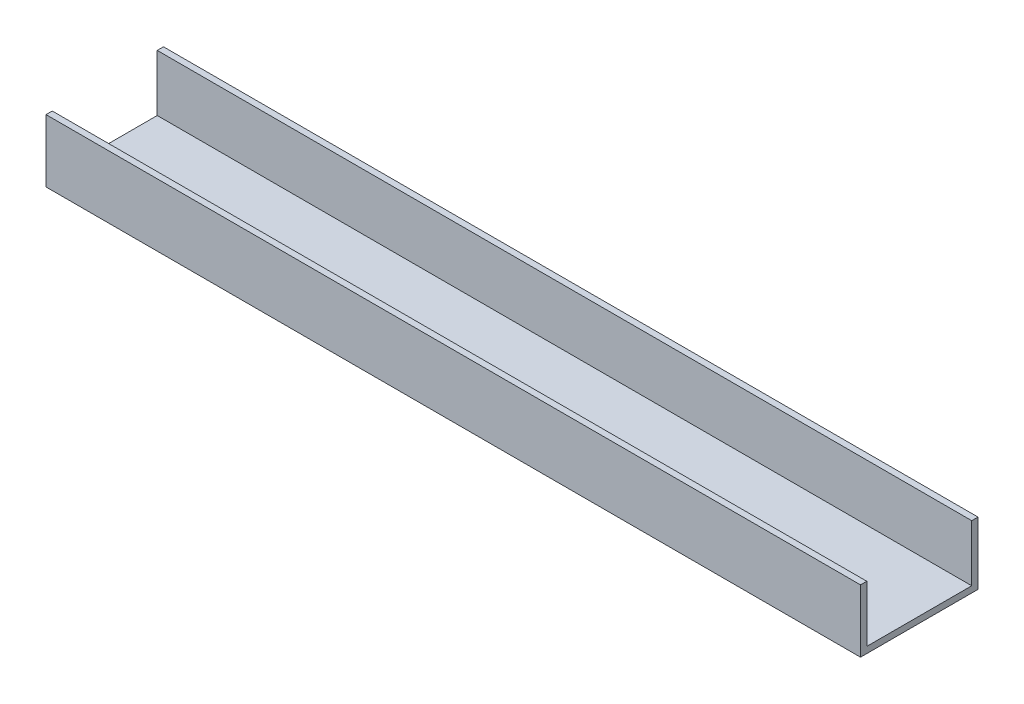
ISO-10303-21;
HEADER;
FILE_DESCRIPTION(('STEP AP214'),'2;1');
FILE_NAME('part.step','',(''),(''),'','','');
FILE_SCHEMA(('AUTOMOTIVE_DESIGN { 1 0 10303 214 1 1 1 1 }'));
ENDSEC;
DATA;
#1=APPLICATION_CONTEXT('core data for automotive mechanical design processes');
#2=APPLICATION_PROTOCOL_DEFINITION('international standard','automotive_design',2000,#1);
#3=PRODUCT_CONTEXT('',#1,'mechanical');
#4=PRODUCT('Part','Part','',(#3));
#5=PRODUCT_RELATED_PRODUCT_CATEGORY('part','',(#4));
#6=PRODUCT_DEFINITION_FORMATION('','',#4);
#7=PRODUCT_DEFINITION_CONTEXT('part definition',#1,'design');
#8=PRODUCT_DEFINITION('design','',#6,#7);
#9=PRODUCT_DEFINITION_SHAPE('','',#8);
#10=(LENGTH_UNIT() NAMED_UNIT(*) SI_UNIT(.MILLI.,.METRE.));
#11=(NAMED_UNIT(*) PLANE_ANGLE_UNIT() SI_UNIT($,.RADIAN.));
#12=(NAMED_UNIT(*) SI_UNIT($,.STERADIAN.) SOLID_ANGLE_UNIT());
#13=UNCERTAINTY_MEASURE_WITH_UNIT(LENGTH_MEASURE(1.E-05),#10,'distance_accuracy_value','');
#14=(GEOMETRIC_REPRESENTATION_CONTEXT(3) GLOBAL_UNCERTAINTY_ASSIGNED_CONTEXT((#13)) GLOBAL_UNIT_ASSIGNED_CONTEXT((#10,
#11,#12)) REPRESENTATION_CONTEXT('',''));
#15=CARTESIAN_POINT('',(0.,0.,0.));
#16=DIRECTION('',(0.,0.,1.));
#17=DIRECTION('',(1.,0.,0.));
#18=AXIS2_PLACEMENT_3D('',#15,#16,#17);
#19=CARTESIAN_POINT('',(0.,4.,0.));
#20=DIRECTION('',(0.,-1.,0.));
#21=DIRECTION('',(0.,0.,-1.));
#22=AXIS2_PLACEMENT_3D('',#19,#20,#21);
#23=PLANE('',#22);
#24=DIRECTION('',(1.,0.,0.));
#25=VECTOR('',#24,1.);
#26=CARTESIAN_POINT('',(520.,4.,-71.));
#27=LINE('',#26,#25);
#28=CARTESIAN_POINT('',(0.,4.,-70.9999999999999));
#29=VERTEX_POINT('',#28);
#30=CARTESIAN_POINT('',(520.,4.,-70.9999999999999));
#31=VERTEX_POINT('',#30);
#32=EDGE_CURVE('E61',#29,#31,#27,.T.);
#33=ORIENTED_EDGE('',*,*,#32,.F.);
#34=DIRECTION('',(0.,0.,1.));
#35=VECTOR('',#34,1.);
#36=CARTESIAN_POINT('',(0.,4.,0.));
#37=LINE('',#36,#35);
#38=CARTESIAN_POINT('',(0.,4.,-4.));
#39=VERTEX_POINT('',#38);
#40=EDGE_CURVE('E169',#29,#39,#37,.T.);
#41=ORIENTED_EDGE('',*,*,#40,.T.);
#42=DIRECTION('',(-1.,0.,0.));
#43=VECTOR('',#42,1.);
#44=CARTESIAN_POINT('',(0.,4.,-4.));
#45=LINE('',#44,#43);
#46=CARTESIAN_POINT('',(520.,4.,-4.));
#47=VERTEX_POINT('',#46);
#48=EDGE_CURVE('E138',#47,#39,#45,.T.);
#49=ORIENTED_EDGE('',*,*,#48,.F.);
#50=DIRECTION('',(0.,0.,-1.));
#51=VECTOR('',#50,1.);
#52=CARTESIAN_POINT('',(520.,4.,0.));
#53=LINE('',#52,#51);
#54=EDGE_CURVE('E66',#47,#31,#53,.T.);
#55=ORIENTED_EDGE('',*,*,#54,.T.);
#56=EDGE_LOOP('',(#33,#41,#49,#55));
#57=FACE_BOUND('',#56,.T.);
#58=ADVANCED_FACE('F45',(#57),#23,.F.);
#59=CARTESIAN_POINT('',(0.,4.,0.));
#60=DIRECTION('',(1.,0.,0.));
#61=DIRECTION('',(0.,0.,-1.));
#62=AXIS2_PLACEMENT_3D('',#59,#60,#61);
#63=PLANE('',#62);
#64=DIRECTION('',(0.,0.,1.));
#65=VECTOR('',#64,1.);
#66=CARTESIAN_POINT('',(0.,0.,0.));
#67=LINE('',#66,#65);
#68=CARTESIAN_POINT('',(0.,0.,-75.));
#69=VERTEX_POINT('',#68);
#70=CARTESIAN_POINT('',(0.,0.,0.));
#71=VERTEX_POINT('',#70);
#72=EDGE_CURVE('E168',#69,#71,#67,.T.);
#73=ORIENTED_EDGE('',*,*,#72,.T.);
#74=DIRECTION('',(0.,-1.,0.));
#75=VECTOR('',#74,1.);
#76=CARTESIAN_POINT('',(0.,4.,0.));
#77=LINE('',#76,#75);
#78=CARTESIAN_POINT('',(0.,40.,0.));
#79=VERTEX_POINT('',#78);
#80=EDGE_CURVE('E11',#79,#71,#77,.T.);
#81=ORIENTED_EDGE('',*,*,#80,.F.);
#82=DIRECTION('',(0.,0.,1.));
#83=VECTOR('',#82,1.);
#84=CARTESIAN_POINT('',(0.,40.,0.));
#85=LINE('',#84,#83);
#86=CARTESIAN_POINT('',(0.,40.,-4.));
#87=VERTEX_POINT('',#86);
#88=EDGE_CURVE('E143',#87,#79,#85,.T.);
#89=ORIENTED_EDGE('',*,*,#88,.F.);
#90=DIRECTION('',(0.,-1.,0.));
#91=VECTOR('',#90,1.);
#92=CARTESIAN_POINT('',(0.,40.,-4.));
#93=LINE('',#92,#91);
#94=EDGE_CURVE('E157',#87,#39,#93,.T.);
#95=ORIENTED_EDGE('',*,*,#94,.T.);
#96=ORIENTED_EDGE('',*,*,#40,.F.);
#97=DIRECTION('',(0.,-1.,0.));
#98=VECTOR('',#97,1.);
#99=CARTESIAN_POINT('',(0.,40.,-70.9999999999999));
#100=LINE('',#99,#98);
#101=CARTESIAN_POINT('',(0.,40.,-70.9999999999999));
#102=VERTEX_POINT('',#101);
#103=EDGE_CURVE('E127',#102,#29,#100,.T.);
#104=ORIENTED_EDGE('',*,*,#103,.F.);
#105=DIRECTION('',(0.,0.,1.));
#106=VECTOR('',#105,1.);
#107=CARTESIAN_POINT('',(0.,40.,-75.));
#108=LINE('',#107,#106);
#109=CARTESIAN_POINT('',(0.,40.,-75.));
#110=VERTEX_POINT('',#109);
#111=EDGE_CURVE('E116',#110,#102,#108,.T.);
#112=ORIENTED_EDGE('',*,*,#111,.F.);
#113=DIRECTION('',(0.,-1.,0.));
#114=VECTOR('',#113,1.);
#115=CARTESIAN_POINT('',(0.,4.,-75.));
#116=LINE('',#115,#114);
#117=EDGE_CURVE('E175',#110,#69,#116,.T.);
#118=ORIENTED_EDGE('',*,*,#117,.T.);
#119=EDGE_LOOP('',(#73,#81,#89,#95,#96,#104,#112,#118));
#120=FACE_BOUND('',#119,.T.);
#121=ADVANCED_FACE('F47',(#120),#63,.F.);
#122=CARTESIAN_POINT('',(0.,4.,0.));
#123=DIRECTION('',(0.,0.,-1.));
#124=DIRECTION('',(-1.,0.,0.));
#125=AXIS2_PLACEMENT_3D('',#122,#123,#124);
#126=PLANE('',#125);
#127=DIRECTION('',(1.,0.,0.));
#128=VECTOR('',#127,1.);
#129=CARTESIAN_POINT('',(0.,0.,0.));
#130=LINE('',#129,#128);
#131=CARTESIAN_POINT('',(520.,0.,0.));
#132=VERTEX_POINT('',#131);
#133=EDGE_CURVE('E179',#71,#132,#130,.T.);
#134=ORIENTED_EDGE('',*,*,#133,.T.);
#135=DIRECTION('',(0.,-1.,0.));
#136=VECTOR('',#135,1.);
#137=CARTESIAN_POINT('',(520.,4.,0.));
#138=LINE('',#137,#136);
#139=CARTESIAN_POINT('',(520.,40.,0.));
#140=VERTEX_POINT('',#139);
#141=EDGE_CURVE('E54',#140,#132,#138,.T.);
#142=ORIENTED_EDGE('',*,*,#141,.F.);
#143=DIRECTION('',(1.,0.,0.));
#144=VECTOR('',#143,1.);
#145=CARTESIAN_POINT('',(0.,40.,0.));
#146=LINE('',#145,#144);
#147=EDGE_CURVE('E147',#79,#140,#146,.T.);
#148=ORIENTED_EDGE('',*,*,#147,.F.);
#149=ORIENTED_EDGE('',*,*,#80,.T.);
#150=EDGE_LOOP('',(#134,#142,#148,#149));
#151=FACE_BOUND('',#150,.T.);
#152=ADVANCED_FACE('F215',(#151),#126,.F.);
#153=CARTESIAN_POINT('',(520.,4.,0.));
#154=DIRECTION('',(-1.,0.,0.));
#155=DIRECTION('',(0.,0.,1.));
#156=AXIS2_PLACEMENT_3D('',#153,#154,#155);
#157=PLANE('',#156);
#158=DIRECTION('',(0.,0.,-1.));
#159=VECTOR('',#158,1.);
#160=CARTESIAN_POINT('',(520.,0.,0.));
#161=LINE('',#160,#159);
#162=CARTESIAN_POINT('',(520.,0.,-75.));
#163=VERTEX_POINT('',#162);
#164=EDGE_CURVE('E182',#132,#163,#161,.T.);
#165=ORIENTED_EDGE('',*,*,#164,.T.);
#166=DIRECTION('',(0.,-1.,0.));
#167=VECTOR('',#166,1.);
#168=CARTESIAN_POINT('',(520.,4.,-75.));
#169=LINE('',#168,#167);
#170=CARTESIAN_POINT('',(520.,40.,-75.));
#171=VERTEX_POINT('',#170);
#172=EDGE_CURVE('E131',#171,#163,#169,.T.);
#173=ORIENTED_EDGE('',*,*,#172,.F.);
#174=DIRECTION('',(0.,0.,-1.));
#175=VECTOR('',#174,1.);
#176=CARTESIAN_POINT('',(520.,40.,-75.));
#177=LINE('',#176,#175);
#178=CARTESIAN_POINT('',(520.,40.,-71.));
#179=VERTEX_POINT('',#178);
#180=EDGE_CURVE('E114',#179,#171,#177,.T.);
#181=ORIENTED_EDGE('',*,*,#180,.F.);
#182=DIRECTION('',(0.,-1.,0.));
#183=VECTOR('',#182,1.);
#184=CARTESIAN_POINT('',(520.,40.,-71.));
#185=LINE('',#184,#183);
#186=EDGE_CURVE('E121',#179,#31,#185,.T.);
#187=ORIENTED_EDGE('',*,*,#186,.T.);
#188=ORIENTED_EDGE('',*,*,#54,.F.);
#189=DIRECTION('',(0.,-1.,0.));
#190=VECTOR('',#189,1.);
#191=CARTESIAN_POINT('',(520.,40.,-4.));
#192=LINE('',#191,#190);
#193=CARTESIAN_POINT('',(520.,40.,-4.));
#194=VERTEX_POINT('',#193);
#195=EDGE_CURVE('E164',#194,#47,#192,.T.);
#196=ORIENTED_EDGE('',*,*,#195,.F.);
#197=DIRECTION('',(0.,0.,-1.));
#198=VECTOR('',#197,1.);
#199=CARTESIAN_POINT('',(520.,40.,0.));
#200=LINE('',#199,#198);
#201=EDGE_CURVE('E151',#140,#194,#200,.T.);
#202=ORIENTED_EDGE('',*,*,#201,.F.);
#203=ORIENTED_EDGE('',*,*,#141,.T.);
#204=EDGE_LOOP('',(#165,#173,#181,#187,#188,#196,#202,#203));
#205=FACE_BOUND('',#204,.T.);
#206=ADVANCED_FACE('F129',(#205),#157,.F.);
#207=CARTESIAN_POINT('',(0.,4.,-75.));
#208=DIRECTION('',(0.,0.,1.));
#209=DIRECTION('',(1.,0.,0.));
#210=AXIS2_PLACEMENT_3D('',#207,#208,#209);
#211=PLANE('',#210);
#212=DIRECTION('',(-1.,0.,0.));
#213=VECTOR('',#212,1.);
#214=CARTESIAN_POINT('',(0.,0.,-75.));
#215=LINE('',#214,#213);
#216=EDGE_CURVE('E172',#163,#69,#215,.T.);
#217=ORIENTED_EDGE('',*,*,#216,.T.);
#218=ORIENTED_EDGE('',*,*,#117,.F.);
#219=DIRECTION('',(-1.,0.,0.));
#220=VECTOR('',#219,1.);
#221=CARTESIAN_POINT('',(520.,40.,-75.));
#222=LINE('',#221,#220);
#223=EDGE_CURVE('E134',#171,#110,#222,.T.);
#224=ORIENTED_EDGE('',*,*,#223,.F.);
#225=ORIENTED_EDGE('',*,*,#172,.T.);
#226=EDGE_LOOP('',(#217,#218,#224,#225));
#227=FACE_BOUND('',#226,.T.);
#228=ADVANCED_FACE('F203',(#227),#211,.F.);
#229=CARTESIAN_POINT('',(0.,0.,0.));
#230=DIRECTION('',(0.,-1.,0.));
#231=DIRECTION('',(0.,0.,-1.));
#232=AXIS2_PLACEMENT_3D('',#229,#230,#231);
#233=PLANE('',#232);
#234=ORIENTED_EDGE('',*,*,#72,.F.);
#235=ORIENTED_EDGE('',*,*,#216,.F.);
#236=ORIENTED_EDGE('',*,*,#164,.F.);
#237=ORIENTED_EDGE('',*,*,#133,.F.);
#238=EDGE_LOOP('',(#234,#235,#236,#237));
#239=FACE_BOUND('',#238,.T.);
#240=ADVANCED_FACE('F201',(#239),#233,.T.);
#241=CARTESIAN_POINT('',(0.,40.,-4.));
#242=DIRECTION('',(0.,0.,1.));
#243=DIRECTION('',(1.,0.,0.));
#244=AXIS2_PLACEMENT_3D('',#241,#242,#243);
#245=PLANE('',#244);
#246=ORIENTED_EDGE('',*,*,#48,.T.);
#247=ORIENTED_EDGE('',*,*,#94,.F.);
#248=DIRECTION('',(-1.,0.,0.));
#249=VECTOR('',#248,1.);
#250=CARTESIAN_POINT('',(0.,40.,-4.));
#251=LINE('',#250,#249);
#252=EDGE_CURVE('E154',#194,#87,#251,.T.);
#253=ORIENTED_EDGE('',*,*,#252,.F.);
#254=ORIENTED_EDGE('',*,*,#195,.T.);
#255=EDGE_LOOP('',(#246,#247,#253,#254));
#256=FACE_BOUND('',#255,.T.);
#257=ADVANCED_FACE('F211',(#256),#245,.F.);
#258=CARTESIAN_POINT('',(0.,40.,0.));
#259=DIRECTION('',(0.,-1.,0.));
#260=DIRECTION('',(0.,0.,-1.));
#261=AXIS2_PLACEMENT_3D('',#258,#259,#260);
#262=PLANE('',#261);
#263=ORIENTED_EDGE('',*,*,#88,.T.);
#264=ORIENTED_EDGE('',*,*,#147,.T.);
#265=ORIENTED_EDGE('',*,*,#201,.T.);
#266=ORIENTED_EDGE('',*,*,#252,.T.);
#267=EDGE_LOOP('',(#263,#264,#265,#266));
#268=FACE_BOUND('',#267,.T.);
#269=ADVANCED_FACE('F214',(#268),#262,.F.);
#270=CARTESIAN_POINT('',(520.,40.,-71.));
#271=DIRECTION('',(0.,0.,-1.));
#272=DIRECTION('',(-1.,0.,0.));
#273=AXIS2_PLACEMENT_3D('',#270,#271,#272);
#274=PLANE('',#273);
#275=ORIENTED_EDGE('',*,*,#32,.T.);
#276=ORIENTED_EDGE('',*,*,#186,.F.);
#277=DIRECTION('',(1.,0.,0.));
#278=VECTOR('',#277,1.);
#279=CARTESIAN_POINT('',(520.,40.,-71.));
#280=LINE('',#279,#278);
#281=EDGE_CURVE('E109',#102,#179,#280,.T.);
#282=ORIENTED_EDGE('',*,*,#281,.F.);
#283=ORIENTED_EDGE('',*,*,#103,.T.);
#284=EDGE_LOOP('',(#275,#276,#282,#283));
#285=FACE_BOUND('',#284,.T.);
#286=ADVANCED_FACE('F124',(#285),#274,.F.);
#287=CARTESIAN_POINT('',(0.,40.,0.));
#288=DIRECTION('',(0.,-1.,0.));
#289=DIRECTION('',(0.,0.,-1.));
#290=AXIS2_PLACEMENT_3D('',#287,#288,#289);
#291=PLANE('',#290);
#292=ORIENTED_EDGE('',*,*,#180,.T.);
#293=ORIENTED_EDGE('',*,*,#223,.T.);
#294=ORIENTED_EDGE('',*,*,#111,.T.);
#295=ORIENTED_EDGE('',*,*,#281,.T.);
#296=EDGE_LOOP('',(#292,#293,#294,#295));
#297=FACE_BOUND('',#296,.T.);
#298=ADVANCED_FACE('F111',(#297),#291,.F.);
#299=CLOSED_SHELL('',(#58,#121,#152,#206,#228,#240,#257,#269,#286,#298));
#300=MANIFOLD_SOLID_BREP('B2',#299);
#301=ADVANCED_BREP_SHAPE_REPRESENTATION('',(#18,#300),#14);
#302=SHAPE_DEFINITION_REPRESENTATION(#9,#301);
ENDSEC;
END-ISO-10303-21;
